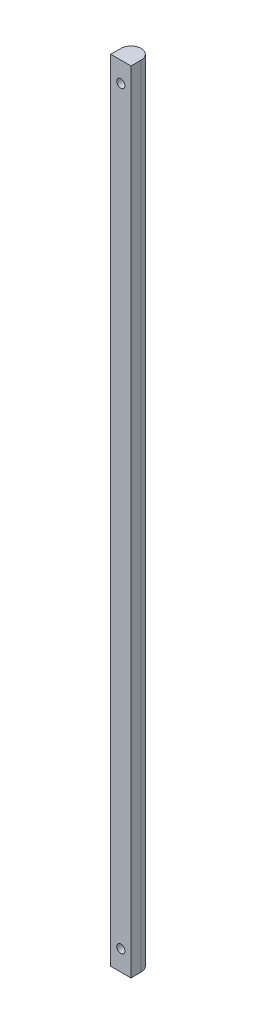
ISO-10303-21;
HEADER;
FILE_DESCRIPTION(('STEP AP214'),'2;1');
FILE_NAME('part.step','',(''),(''),'','','');
FILE_SCHEMA(('AUTOMOTIVE_DESIGN { 1 0 10303 214 1 1 1 1 }'));
ENDSEC;
DATA;
#1=APPLICATION_CONTEXT('core data for automotive mechanical design processes');
#2=APPLICATION_PROTOCOL_DEFINITION('international standard','automotive_design',2000,#1);
#3=PRODUCT_CONTEXT('',#1,'mechanical');
#4=PRODUCT('Part','Part','',(#3));
#5=PRODUCT_RELATED_PRODUCT_CATEGORY('part','',(#4));
#6=PRODUCT_DEFINITION_FORMATION('','',#4);
#7=PRODUCT_DEFINITION_CONTEXT('part definition',#1,'design');
#8=PRODUCT_DEFINITION('design','',#6,#7);
#9=PRODUCT_DEFINITION_SHAPE('','',#8);
#10=(LENGTH_UNIT() NAMED_UNIT(*) SI_UNIT(.MILLI.,.METRE.));
#11=(NAMED_UNIT(*) PLANE_ANGLE_UNIT() SI_UNIT($,.RADIAN.));
#12=(NAMED_UNIT(*) SI_UNIT($,.STERADIAN.) SOLID_ANGLE_UNIT());
#13=UNCERTAINTY_MEASURE_WITH_UNIT(LENGTH_MEASURE(1.E-05),#10,'distance_accuracy_value','');
#14=(GEOMETRIC_REPRESENTATION_CONTEXT(3) GLOBAL_UNCERTAINTY_ASSIGNED_CONTEXT((#13)) GLOBAL_UNIT_ASSIGNED_CONTEXT((#10,
#11,#12)) REPRESENTATION_CONTEXT('',''));
#15=CARTESIAN_POINT('',(0.,0.,0.));
#16=DIRECTION('',(0.,0.,1.));
#17=DIRECTION('',(1.,0.,0.));
#18=AXIS2_PLACEMENT_3D('',#15,#16,#17);
#19=CARTESIAN_POINT('',(0.,123.825,-3.175));
#20=DIRECTION('',(0.,-1.,0.));
#21=DIRECTION('',(0.,0.,-1.));
#22=AXIS2_PLACEMENT_3D('',#19,#20,#21);
#23=CYLINDRICAL_SURFACE('',#22,3.175);
#24=CARTESIAN_POINT('',(0.,116.18595,-6.35));
#25=CARTESIAN_POINT('',(0.0691991170808229,116.185956788068,-6.34999494878284));
#26=CARTESIAN_POINT('',(0.138514448645238,116.191555341976,-6.34771128002319));
#27=CARTESIAN_POINT('',(0.275187458737668,116.213754018676,-6.33879808003825));
#28=CARTESIAN_POINT('',(0.342539383129636,116.230383631502,-6.33215690011809));
#29=CARTESIAN_POINT('',(0.473087021310062,116.273935839912,-6.31524364494565));
#30=CARTESIAN_POINT('',(0.536295708180401,116.300824312642,-6.30498361510931));
#31=CARTESIAN_POINT('',(0.657246364636683,116.363993653507,-6.28183907891045));
#32=CARTESIAN_POINT('',(0.714990136684526,116.400271409981,-6.26895544232704));
#33=CARTESIAN_POINT('',(0.826242629051796,116.48303798756,-6.24116693926225));
#34=CARTESIAN_POINT('',(0.879453289167616,116.529905806007,-6.22619808843745));
#35=CARTESIAN_POINT('',(0.977512911869515,116.631721710038,-6.19621300876413));
#36=CARTESIAN_POINT('',(1.02235767455051,116.686673829532,-6.18119675994665));
#37=CARTESIAN_POINT('',(1.10445361995858,116.806176975847,-6.15204466177736));
#38=CARTESIAN_POINT('',(1.14125872964486,116.871053999478,-6.13798144758871));
#39=CARTESIAN_POINT('',(1.20330090876947,117.006733466404,-6.11333536275321));
#40=CARTESIAN_POINT('',(1.22854363847174,117.077532990269,-6.10275078988582));
#41=CARTESIAN_POINT('',(1.26552995014933,117.219620296577,-6.08694932324813));
#42=CARTESIAN_POINT('',(1.27784529118986,117.290733156439,-6.08150625748732));
#43=CARTESIAN_POINT('',(1.29041253820246,117.434208322782,-6.07595030426477));
#44=CARTESIAN_POINT('',(1.29067062652423,117.506569969908,-6.07583468515811));
#45=CARTESIAN_POINT('',(1.27954838927626,117.644924216132,-6.08075429064617));
#46=CARTESIAN_POINT('',(1.26900566717996,117.710999922727,-6.08541882210552));
#47=CARTESIAN_POINT('',(1.23798066165121,117.840347861588,-6.0987494612119));
#48=CARTESIAN_POINT('',(1.21749658508013,117.903619585847,-6.10741629074641));
#49=CARTESIAN_POINT('',(1.16677664432287,118.027116233062,-6.12796740817153));
#50=CARTESIAN_POINT('',(1.13634738556802,118.087250778693,-6.13991468325851));
#51=CARTESIAN_POINT('',(1.06673695185948,118.201785820865,-6.16566416352443));
#52=CARTESIAN_POINT('',(1.02755242891495,118.256184112133,-6.17946707748857));
#53=CARTESIAN_POINT('',(0.937867550666348,118.362273896899,-6.20871449812304));
#54=CARTESIAN_POINT('',(0.886713453390287,118.413402375971,-6.22420207670568));
#55=CARTESIAN_POINT('',(0.776396004733478,118.506538369481,-6.25413921024311));
#56=CARTESIAN_POINT('',(0.717230965144648,118.548543956509,-6.2685885454157));
#57=CARTESIAN_POINT('',(0.590933707198551,118.623011119083,-6.29520310800086));
#58=CARTESIAN_POINT('',(0.523660769986689,118.655254776155,-6.30731426034368));
#59=CARTESIAN_POINT('',(0.384028809868175,118.707772211686,-6.327476877027));
#60=CARTESIAN_POINT('',(0.311672473755064,118.728052260945,-6.33553046784028));
#61=CARTESIAN_POINT('',(0.168641898681412,118.754914035715,-6.34627953592641));
#62=CARTESIAN_POINT('',(0.0981318255811727,118.762252010128,-6.34927037549045));
#63=CARTESIAN_POINT('',(-0.0431691778579922,118.765262047857,-6.35049175469347));
#64=CARTESIAN_POINT('',(-0.113960027542253,118.760937248841,-6.34872357466488));
#65=CARTESIAN_POINT('',(-0.250344995389924,118.741295473728,-6.34081834382161));
#66=CARTESIAN_POINT('',(-0.316027571427211,118.726499988219,-6.33488866781712));
#67=CARTESIAN_POINT('',(-0.443913481919017,118.687052163847,-6.31947407528921));
#68=CARTESIAN_POINT('',(-0.506116370652858,118.662398565518,-6.30998870450208));
#69=CARTESIAN_POINT('',(-0.627434557573657,118.603128626758,-6.28801625437917));
#70=CARTESIAN_POINT('',(-0.686395814260261,118.568228899906,-6.27544574313742));
#71=CARTESIAN_POINT('',(-0.79783382236026,118.489770625462,-6.24865843400418));
#72=CARTESIAN_POINT('',(-0.850307918909783,118.446208551713,-6.23444096667786));
#73=CARTESIAN_POINT('',(-0.951026543140727,118.348192421997,-6.20470562715203));
#74=CARTESIAN_POINT('',(-0.998741114888621,118.293199271231,-6.18916505256559));
#75=CARTESIAN_POINT('',(-1.08440104458421,118.175720856224,-6.15941967611857));
#76=CARTESIAN_POINT('',(-1.12234458519762,118.113234201413,-6.1452151230588));
#77=CARTESIAN_POINT('',(-1.18768318457142,117.981480569898,-6.11970431782529));
#78=CARTESIAN_POINT('',(-1.21495482686029,117.912145249523,-6.10843245344576));
#79=CARTESIAN_POINT('',(-1.25721698429187,117.769268559694,-6.09057314753681));
#80=CARTESIAN_POINT('',(-1.2722169384638,117.69573046956,-6.08398210616891));
#81=CARTESIAN_POINT('',(-1.28859508015926,117.552382904157,-6.07676160650549));
#82=CARTESIAN_POINT('',(-1.2908967198223,117.482698691789,-6.07572814139085));
#83=CARTESIAN_POINT('',(-1.28425228510169,117.343983779239,-6.07867601428325));
#84=CARTESIAN_POINT('',(-1.27530773909969,117.274952991539,-6.08265667086014));
#85=CARTESIAN_POINT('',(-1.24718689304565,117.142479218033,-6.09482321951612));
#86=CARTESIAN_POINT('',(-1.22845580313664,117.078923309118,-6.10282559452905));
#87=CARTESIAN_POINT('',(-1.18171667348738,116.955834512828,-6.12199939284952));
#88=CARTESIAN_POINT('',(-1.15370605515247,116.896302749225,-6.1331716968927));
#89=CARTESIAN_POINT('',(-1.08731746525223,116.779166820985,-6.15823530583221));
#90=CARTESIAN_POINT('',(-1.04843009803694,116.721877607109,-6.17224719173308));
#91=CARTESIAN_POINT('',(-0.96212525088794,116.614348306853,-6.20105482524189));
#92=CARTESIAN_POINT('',(-0.9147050595382,116.564110470199,-6.21585082095353));
#93=CARTESIAN_POINT('',(-0.808865748077677,116.46861939811,-6.24576238710602));
#94=CARTESIAN_POINT('',(-0.749919587011663,116.423933241831,-6.26083186881097));
#95=CARTESIAN_POINT('',(-0.624798009827087,116.345069019544,-6.28857548380923));
#96=CARTESIAN_POINT('',(-0.55861928058083,116.310895796925,-6.30124851200542));
#97=CARTESIAN_POINT('',(-0.422063336305991,116.254809152999,-6.3225671606999));
#98=CARTESIAN_POINT('',(-0.351782819012527,116.232686658881,-6.33128099638565));
#99=CARTESIAN_POINT('',(-0.208203856400565,116.200765168937,-6.34397908859924));
#100=CARTESIAN_POINT('',(-0.13491570747754,116.190927247903,-6.34797828179879));
#101=CARTESIAN_POINT('',(-0.0409571719211323,116.186435944817,-6.34980333267174));
#102=CARTESIAN_POINT('',(-0.0204836774519322,116.185947990659,-6.35000149521421));
#103=CARTESIAN_POINT('',(0.,116.18595,-6.35));
#104=B_SPLINE_CURVE_WITH_KNOTS('',3,(#24,#25,#26,#27,#28,#29,#30,#31,#32,#33,#34,#35,#36,#37,
#38,#39,#40,#41,#42,#43,#44,#45,#46,#47,#48,#49,#50,#51,#52,#53,#54,#55,#56,#57,#58,#59,#60,#61,
#62,#63,#64,#65,#66,#67,#68,#69,#70,#71,#72,#73,#74,#75,#76,#77,#78,#79,#80,#81,#82,#83,#84,#85,
#86,#87,#88,#89,#90,#91,#92,#93,#94,#95,#96,#97,#98,#99,#100,#101,#102,#103),.UNSPECIFIED.,.T.,
.F.,(4,2,2,2,2,2,2,2,2,2,2,2,2,2,2,2,2,2,2,2,2,2,2,2,2,2,2,2,2,2,2,2,2,2,2,2,2,2,2,4),(0.,
0.2075413266167,0.415639734921062,0.623051920280876,0.8303954558898,1.04686045974,
1.26343384409847,1.49000426712626,1.71646365569269,1.93242050038483,2.14826661210773,
2.34855365224723,2.54887683192717,2.7533536718053,2.9579088373367,3.1787983054186,
3.39973439591492,3.62529000925708,3.85072729091377,4.06249091564621,4.27419757470954,
4.47604123804456,4.67791069704711,4.88599585529143,5.09416589223805,5.31648608861492,
5.53884760496836,5.76370959278774,5.98839846019681,6.19650800502097,6.40458927035164,
6.60393683866939,6.80333984820439,7.01437321947173,7.22547376814521,7.45085448578607,
7.67633888306081,7.89777542509607,8.1185085224396,8.17994297090802),.UNSPECIFIED.);
#105=CARTESIAN_POINT('',(0.,116.18595,-6.35));
#106=VERTEX_POINT('',#105);
#107=EDGE_CURVE('E11',#106,#106,#104,.T.);
#108=ORIENTED_EDGE('',*,*,#107,.T.);
#109=EDGE_LOOP('',(#108));
#110=FACE_BOUND('',#109,.T.);
#111=CARTESIAN_POINT('',(0.,-118.76405,-6.35));
#112=CARTESIAN_POINT('',(0.0691991170808229,-118.764043211932,-6.34999494878284));
#113=CARTESIAN_POINT('',(0.138514448645238,-118.758444658024,-6.34771128002319));
#114=CARTESIAN_POINT('',(0.275187458737668,-118.736245981324,-6.33879808003825));
#115=CARTESIAN_POINT('',(0.342539383129636,-118.719616368498,-6.33215690011809));
#116=CARTESIAN_POINT('',(0.473087021310062,-118.676064160088,-6.31524364494565));
#117=CARTESIAN_POINT('',(0.536295708180401,-118.649175687358,-6.30498361510931));
#118=CARTESIAN_POINT('',(0.657246364636683,-118.586006346493,-6.28183907891045));
#119=CARTESIAN_POINT('',(0.714990136684526,-118.549728590019,-6.26895544232704));
#120=CARTESIAN_POINT('',(0.826242629051796,-118.46696201244,-6.24116693926225));
#121=CARTESIAN_POINT('',(0.879453289167616,-118.420094193993,-6.22619808843745));
#122=CARTESIAN_POINT('',(0.977512911869515,-118.318278289962,-6.19621300876413));
#123=CARTESIAN_POINT('',(1.02235767455051,-118.263326170468,-6.18119675994665));
#124=CARTESIAN_POINT('',(1.10445361995858,-118.143823024153,-6.15204466177736));
#125=CARTESIAN_POINT('',(1.14125872964486,-118.078946000522,-6.13798144758871));
#126=CARTESIAN_POINT('',(1.20330090876947,-117.943266533596,-6.11333536275321));
#127=CARTESIAN_POINT('',(1.22854363847174,-117.872467009731,-6.10275078988582));
#128=CARTESIAN_POINT('',(1.26552995014933,-117.730379703423,-6.08694932324813));
#129=CARTESIAN_POINT('',(1.27784529118986,-117.659266843561,-6.08150625748732));
#130=CARTESIAN_POINT('',(1.29041253820246,-117.515791677218,-6.07595030426477));
#131=CARTESIAN_POINT('',(1.29067062652423,-117.443430030092,-6.07583468515811));
#132=CARTESIAN_POINT('',(1.27954838927626,-117.305075783868,-6.08075429064617));
#133=CARTESIAN_POINT('',(1.26900566717996,-117.239000077273,-6.08541882210551));
#134=CARTESIAN_POINT('',(1.23798066165121,-117.109652138412,-6.09874946121189));
#135=CARTESIAN_POINT('',(1.21749658508013,-117.046380414153,-6.10741629074641));
#136=CARTESIAN_POINT('',(1.16677664432287,-116.922883766938,-6.12796740817153));
#137=CARTESIAN_POINT('',(1.13634738556802,-116.862749221307,-6.13991468325851));
#138=CARTESIAN_POINT('',(1.06673695185948,-116.748214179135,-6.16566416352443));
#139=CARTESIAN_POINT('',(1.02755242891495,-116.693815887866,-6.17946707748857));
#140=CARTESIAN_POINT('',(0.937867550666344,-116.587726103101,-6.20871449812304));
#141=CARTESIAN_POINT('',(0.886713453390279,-116.536597624029,-6.22420207670569));
#142=CARTESIAN_POINT('',(0.776396004733469,-116.443461630519,-6.25413921024311));
#143=CARTESIAN_POINT('',(0.717230965144644,-116.401456043491,-6.2685885454157));
#144=CARTESIAN_POINT('',(0.590933707198547,-116.326988880917,-6.29520310800086));
#145=CARTESIAN_POINT('',(0.52366076998668,-116.294745223845,-6.30731426034368));
#146=CARTESIAN_POINT('',(0.384028809868165,-116.242227788314,-6.32747687702701));
#147=CARTESIAN_POINT('',(0.31167247375506,-116.221947739054,-6.33553046784028));
#148=CARTESIAN_POINT('',(0.168641898681413,-116.195085964285,-6.34627953592641));
#149=CARTESIAN_POINT('',(0.0981318255811732,-116.187747989872,-6.34927037549045));
#150=CARTESIAN_POINT('',(-0.0431691778579919,-116.184737952143,-6.35049175469347));
#151=CARTESIAN_POINT('',(-0.113960027542253,-116.189062751159,-6.34872357466488));
#152=CARTESIAN_POINT('',(-0.250344995389924,-116.208704526272,-6.34081834382161));
#153=CARTESIAN_POINT('',(-0.316027571427211,-116.223500011781,-6.33488866781712));
#154=CARTESIAN_POINT('',(-0.443913481919017,-116.262947836153,-6.31947407528921));
#155=CARTESIAN_POINT('',(-0.506116370652858,-116.287601434482,-6.30998870450208));
#156=CARTESIAN_POINT('',(-0.627434557573657,-116.346871373242,-6.28801625437917));
#157=CARTESIAN_POINT('',(-0.686395814260261,-116.381771100094,-6.27544574313742));
#158=CARTESIAN_POINT('',(-0.79783382236026,-116.460229374538,-6.24865843400418));
#159=CARTESIAN_POINT('',(-0.850307918909783,-116.503791448287,-6.23444096667786));
#160=CARTESIAN_POINT('',(-0.951026543140727,-116.601807578003,-6.20470562715203));
#161=CARTESIAN_POINT('',(-0.998741114888621,-116.656800728769,-6.18916505256559));
#162=CARTESIAN_POINT('',(-1.08440104458421,-116.774279143776,-6.15941967611857));
#163=CARTESIAN_POINT('',(-1.12234458519762,-116.836765798587,-6.1452151230588));
#164=CARTESIAN_POINT('',(-1.18768318457141,-116.968519430102,-6.11970431782529));
#165=CARTESIAN_POINT('',(-1.21495482686028,-117.037854750477,-6.10843245344576));
#166=CARTESIAN_POINT('',(-1.25721698429186,-117.180731440306,-6.09057314753681));
#167=CARTESIAN_POINT('',(-1.2722169384638,-117.25426953044,-6.08398210616892));
#168=CARTESIAN_POINT('',(-1.28859508015926,-117.397617095843,-6.07676160650549));
#169=CARTESIAN_POINT('',(-1.2908967198223,-117.467301308211,-6.07572814139085));
#170=CARTESIAN_POINT('',(-1.28425228510169,-117.606016220761,-6.07867601428325));
#171=CARTESIAN_POINT('',(-1.27530773909969,-117.675047008461,-6.08265667086014));
#172=CARTESIAN_POINT('',(-1.24718689304565,-117.807520781967,-6.09482321951612));
#173=CARTESIAN_POINT('',(-1.22845580313664,-117.871076690882,-6.10282559452905));
#174=CARTESIAN_POINT('',(-1.18171667348738,-117.994165487172,-6.12199939284952));
#175=CARTESIAN_POINT('',(-1.15370605515247,-118.053697250775,-6.1331716968927));
#176=CARTESIAN_POINT('',(-1.08731746525223,-118.170833179015,-6.15823530583221));
#177=CARTESIAN_POINT('',(-1.04843009803694,-118.228122392891,-6.17224719173308));
#178=CARTESIAN_POINT('',(-0.96212525088794,-118.335651693147,-6.20105482524189));
#179=CARTESIAN_POINT('',(-0.9147050595382,-118.385889529801,-6.21585082095353));
#180=CARTESIAN_POINT('',(-0.808865748077677,-118.48138060189,-6.24576238710602));
#181=CARTESIAN_POINT('',(-0.749919587011663,-118.526066758169,-6.26083186881097));
#182=CARTESIAN_POINT('',(-0.624798009827087,-118.604930980456,-6.28857548380923));
#183=CARTESIAN_POINT('',(-0.55861928058083,-118.639104203075,-6.30124851200542));
#184=CARTESIAN_POINT('',(-0.422063336305991,-118.695190847001,-6.3225671606999));
#185=CARTESIAN_POINT('',(-0.351782819012527,-118.717313341119,-6.33128099638565));
#186=CARTESIAN_POINT('',(-0.208203856400565,-118.749234831063,-6.34397908859924));
#187=CARTESIAN_POINT('',(-0.13491570747754,-118.759072752097,-6.34797828179879));
#188=CARTESIAN_POINT('',(-0.0409571719211323,-118.763564055183,-6.34980333267174));
#189=CARTESIAN_POINT('',(-0.0204836774519322,-118.764052009341,-6.35000149521421));
#190=CARTESIAN_POINT('',(0.,-118.76405,-6.35));
#191=B_SPLINE_CURVE_WITH_KNOTS('',3,(#111,#112,#113,#114,#115,#116,#117,#118,#119,#120,#121,
#122,#123,#124,#125,#126,#127,#128,#129,#130,#131,#132,#133,#134,#135,#136,#137,#138,#139,#140,
#141,#142,#143,#144,#145,#146,#147,#148,#149,#150,#151,#152,#153,#154,#155,#156,#157,#158,#159,
#160,#161,#162,#163,#164,#165,#166,#167,#168,#169,#170,#171,#172,#173,#174,#175,#176,#177,#178,
#179,#180,#181,#182,#183,#184,#185,#186,#187,#188,#189,#190),.UNSPECIFIED.,.T.,.F.,(4,2,2,2,2,2,
2,2,2,2,2,2,2,2,2,2,2,2,2,2,2,2,2,2,2,2,2,2,2,2,2,2,2,2,2,2,2,2,2,4),(0.,0.2075413266167,
0.415639734921062,0.623051920280876,0.8303954558898,1.04686045974,1.26343384409847,
1.49000426712626,1.71646365569269,1.93242050038483,2.14826661210773,2.34855365224722,
2.54887683192717,2.7533536718053,2.9579088373367,3.17879830541862,3.39973439591492,
3.62529000925709,3.85072729091377,4.06249091564621,4.27419757470954,4.47604123804456,
4.67791069704711,4.88599585529143,5.09416589223805,5.31648608861492,5.53884760496836,
5.76370959278772,5.98839846019681,6.19650800502097,6.40458927035164,6.60393683866939,
6.80333984820439,7.01437321947173,7.22547376814521,7.45085448578608,7.67633888306081,
7.89777542509607,8.1185085224396,8.17994297090803),.UNSPECIFIED.);
#192=CARTESIAN_POINT('',(0.,-118.76405,-6.35));
#193=VERTEX_POINT('',#192);
#194=EDGE_CURVE('E51',#193,#193,#191,.T.);
#195=ORIENTED_EDGE('',*,*,#194,.T.);
#196=EDGE_LOOP('',(#195));
#197=FACE_BOUND('',#196,.T.);
#198=CARTESIAN_POINT('',(0.,-123.825,-3.175));
#199=DIRECTION('',(0.,1.,0.));
#200=DIRECTION('',(0.,0.,-1.));
#201=AXIS2_PLACEMENT_3D('',#198,#199,#200);
#202=CIRCLE('',#201,3.175);
#203=CARTESIAN_POINT('',(3.175,-123.825,-3.175));
#204=VERTEX_POINT('',#203);
#205=CARTESIAN_POINT('',(-3.175,-123.825,-3.175));
#206=VERTEX_POINT('',#205);
#207=EDGE_CURVE('E110',#204,#206,#202,.T.);
#208=ORIENTED_EDGE('',*,*,#207,.T.);
#209=DIRECTION('',(0.,-1.,0.));
#210=VECTOR('',#209,1.);
#211=CARTESIAN_POINT('',(-3.175,123.825,-3.175));
#212=LINE('',#211,#210);
#213=CARTESIAN_POINT('',(-3.175,123.825,-3.175));
#214=VERTEX_POINT('',#213);
#215=EDGE_CURVE('E101',#214,#206,#212,.T.);
#216=ORIENTED_EDGE('',*,*,#215,.F.);
#217=CARTESIAN_POINT('',(0.,123.825,-3.175));
#218=DIRECTION('',(0.,1.,0.));
#219=DIRECTION('',(0.,0.,-1.));
#220=AXIS2_PLACEMENT_3D('',#217,#218,#219);
#221=CIRCLE('',#220,3.175);
#222=CARTESIAN_POINT('',(3.175,123.825,-3.175));
#223=VERTEX_POINT('',#222);
#224=EDGE_CURVE('E95',#223,#214,#221,.T.);
#225=ORIENTED_EDGE('',*,*,#224,.F.);
#226=DIRECTION('',(0.,-1.,0.));
#227=VECTOR('',#226,1.);
#228=CARTESIAN_POINT('',(3.175,123.825,-3.175));
#229=LINE('',#228,#227);
#230=EDGE_CURVE('E106',#223,#204,#229,.T.);
#231=ORIENTED_EDGE('',*,*,#230,.T.);
#232=EDGE_LOOP('',(#208,#216,#225,#231));
#233=FACE_BOUND('',#232,.T.);
#234=ADVANCED_FACE('F38',(#110,#197,#233),#23,.T.);
#235=CARTESIAN_POINT('',(-3.175,123.825,-3.175));
#236=DIRECTION('',(1.,0.,0.));
#237=DIRECTION('',(0.,0.,-1.));
#238=AXIS2_PLACEMENT_3D('',#235,#236,#237);
#239=PLANE('',#238);
#240=DIRECTION('',(0.,0.,1.));
#241=VECTOR('',#240,1.);
#242=CARTESIAN_POINT('',(-3.175,-123.825,-3.175));
#243=LINE('',#242,#241);
#244=CARTESIAN_POINT('',(-3.175,-123.825,0.));
#245=VERTEX_POINT('',#244);
#246=EDGE_CURVE('E100',#206,#245,#243,.T.);
#247=ORIENTED_EDGE('',*,*,#246,.T.);
#248=DIRECTION('',(0.,-1.,0.));
#249=VECTOR('',#248,1.);
#250=CARTESIAN_POINT('',(-3.175,123.825,0.));
#251=LINE('',#250,#249);
#252=CARTESIAN_POINT('',(-3.175,123.825,0.));
#253=VERTEX_POINT('',#252);
#254=EDGE_CURVE('E98',#253,#245,#251,.T.);
#255=ORIENTED_EDGE('',*,*,#254,.F.);
#256=DIRECTION('',(0.,0.,1.));
#257=VECTOR('',#256,1.);
#258=CARTESIAN_POINT('',(-3.175,123.825,-3.175));
#259=LINE('',#258,#257);
#260=EDGE_CURVE('E90',#214,#253,#259,.T.);
#261=ORIENTED_EDGE('',*,*,#260,.F.);
#262=ORIENTED_EDGE('',*,*,#215,.T.);
#263=EDGE_LOOP('',(#247,#255,#261,#262));
#264=FACE_BOUND('',#263,.T.);
#265=ADVANCED_FACE('F99',(#264),#239,.F.);
#266=CARTESIAN_POINT('',(-3.175,123.825,0.));
#267=DIRECTION('',(0.,0.,-1.));
#268=DIRECTION('',(-1.,0.,0.));
#269=AXIS2_PLACEMENT_3D('',#266,#267,#268);
#270=PLANE('',#269);
#271=CARTESIAN_POINT('',(0.,117.475,0.));
#272=DIRECTION('',(0.,0.,1.));
#273=DIRECTION('',(1.,0.,0.));
#274=AXIS2_PLACEMENT_3D('',#271,#272,#273);
#275=CIRCLE('',#274,1.28905);
#276=CARTESIAN_POINT('',(1.28905,117.475,0.));
#277=VERTEX_POINT('',#276);
#278=EDGE_CURVE('E157',#277,#277,#275,.T.);
#279=ORIENTED_EDGE('',*,*,#278,.F.);
#280=EDGE_LOOP('',(#279));
#281=FACE_BOUND('',#280,.T.);
#282=CARTESIAN_POINT('',(0.,-117.475,0.));
#283=DIRECTION('',(0.,0.,1.));
#284=DIRECTION('',(1.,0.,0.));
#285=AXIS2_PLACEMENT_3D('',#282,#283,#284);
#286=CIRCLE('',#285,1.28905);
#287=CARTESIAN_POINT('',(1.28905,-117.475,0.));
#288=VERTEX_POINT('',#287);
#289=EDGE_CURVE('E113',#288,#288,#286,.T.);
#290=ORIENTED_EDGE('',*,*,#289,.F.);
#291=EDGE_LOOP('',(#290));
#292=FACE_BOUND('',#291,.T.);
#293=DIRECTION('',(1.,0.,0.));
#294=VECTOR('',#293,1.);
#295=CARTESIAN_POINT('',(-3.175,-123.825,0.));
#296=LINE('',#295,#294);
#297=CARTESIAN_POINT('',(3.175,-123.825,0.));
#298=VERTEX_POINT('',#297);
#299=EDGE_CURVE('E76',#245,#298,#296,.T.);
#300=ORIENTED_EDGE('',*,*,#299,.T.);
#301=DIRECTION('',(0.,-1.,0.));
#302=VECTOR('',#301,1.);
#303=CARTESIAN_POINT('',(3.175,123.825,0.));
#304=LINE('',#303,#302);
#305=CARTESIAN_POINT('',(3.175,123.825,0.));
#306=VERTEX_POINT('',#305);
#307=EDGE_CURVE('E102',#306,#298,#304,.T.);
#308=ORIENTED_EDGE('',*,*,#307,.F.);
#309=DIRECTION('',(1.,0.,0.));
#310=VECTOR('',#309,1.);
#311=CARTESIAN_POINT('',(-3.175,123.825,0.));
#312=LINE('',#311,#310);
#313=EDGE_CURVE('E93',#253,#306,#312,.T.);
#314=ORIENTED_EDGE('',*,*,#313,.F.);
#315=ORIENTED_EDGE('',*,*,#254,.T.);
#316=EDGE_LOOP('',(#300,#308,#314,#315));
#317=FACE_BOUND('',#316,.T.);
#318=ADVANCED_FACE('F104',(#281,#292,#317),#270,.F.);
#319=CARTESIAN_POINT('',(3.175,123.825,0.));
#320=DIRECTION('',(-1.,0.,0.));
#321=DIRECTION('',(0.,0.,1.));
#322=AXIS2_PLACEMENT_3D('',#319,#320,#321);
#323=PLANE('',#322);
#324=DIRECTION('',(0.,0.,-1.));
#325=VECTOR('',#324,1.);
#326=CARTESIAN_POINT('',(3.175,-123.825,0.));
#327=LINE('',#326,#325);
#328=EDGE_CURVE('E82',#298,#204,#327,.T.);
#329=ORIENTED_EDGE('',*,*,#328,.T.);
#330=ORIENTED_EDGE('',*,*,#230,.F.);
#331=DIRECTION('',(0.,0.,-1.));
#332=VECTOR('',#331,1.);
#333=CARTESIAN_POINT('',(3.175,123.825,0.));
#334=LINE('',#333,#332);
#335=EDGE_CURVE('E59',#306,#223,#334,.T.);
#336=ORIENTED_EDGE('',*,*,#335,.F.);
#337=ORIENTED_EDGE('',*,*,#307,.T.);
#338=EDGE_LOOP('',(#329,#330,#336,#337));
#339=FACE_BOUND('',#338,.T.);
#340=ADVANCED_FACE('F134',(#339),#323,.F.);
#341=CARTESIAN_POINT('',(0.,123.825,-3.175));
#342=DIRECTION('',(0.,-1.,0.));
#343=DIRECTION('',(0.,0.,-1.));
#344=AXIS2_PLACEMENT_3D('',#341,#342,#343);
#345=PLANE('',#344);
#346=ORIENTED_EDGE('',*,*,#224,.T.);
#347=ORIENTED_EDGE('',*,*,#260,.T.);
#348=ORIENTED_EDGE('',*,*,#313,.T.);
#349=ORIENTED_EDGE('',*,*,#335,.T.);
#350=EDGE_LOOP('',(#346,#347,#348,#349));
#351=FACE_BOUND('',#350,.T.);
#352=ADVANCED_FACE('F91',(#351),#345,.F.);
#353=CARTESIAN_POINT('',(0.,-123.825,-3.175));
#354=DIRECTION('',(0.,-1.,0.));
#355=DIRECTION('',(0.,0.,-1.));
#356=AXIS2_PLACEMENT_3D('',#353,#354,#355);
#357=PLANE('',#356);
#358=ORIENTED_EDGE('',*,*,#207,.F.);
#359=ORIENTED_EDGE('',*,*,#328,.F.);
#360=ORIENTED_EDGE('',*,*,#299,.F.);
#361=ORIENTED_EDGE('',*,*,#246,.F.);
#362=EDGE_LOOP('',(#358,#359,#360,#361));
#363=FACE_BOUND('',#362,.T.);
#364=ADVANCED_FACE('F129',(#363),#357,.T.);
#365=CARTESIAN_POINT('',(0.,-117.475,0.));
#366=DIRECTION('',(0.,0.,1.));
#367=DIRECTION('',(1.,0.,0.));
#368=AXIS2_PLACEMENT_3D('',#365,#366,#367);
#369=CYLINDRICAL_SURFACE('',#368,1.28905);
#370=ORIENTED_EDGE('',*,*,#289,.T.);
#371=EDGE_LOOP('',(#370));
#372=FACE_BOUND('',#371,.T.);
#373=ORIENTED_EDGE('',*,*,#194,.F.);
#374=EDGE_LOOP('',(#373));
#375=FACE_BOUND('',#374,.T.);
#376=ADVANCED_FACE('F124',(#372,#375),#369,.F.);
#377=CARTESIAN_POINT('',(0.,117.475,0.));
#378=DIRECTION('',(0.,0.,1.));
#379=DIRECTION('',(1.,0.,0.));
#380=AXIS2_PLACEMENT_3D('',#377,#378,#379);
#381=CYLINDRICAL_SURFACE('',#380,1.28905);
#382=ORIENTED_EDGE('',*,*,#278,.T.);
#383=EDGE_LOOP('',(#382));
#384=FACE_BOUND('',#383,.T.);
#385=ORIENTED_EDGE('',*,*,#107,.F.);
#386=EDGE_LOOP('',(#385));
#387=FACE_BOUND('',#386,.T.);
#388=ADVANCED_FACE('F128',(#384,#387),#381,.F.);
#389=CLOSED_SHELL('',(#234,#265,#318,#340,#352,#364,#376,#388));
#390=MANIFOLD_SOLID_BREP('B2',#389);
#391=ADVANCED_BREP_SHAPE_REPRESENTATION('',(#18,#390),#14);
#392=SHAPE_DEFINITION_REPRESENTATION(#9,#391);
ENDSEC;
END-ISO-10303-21;
